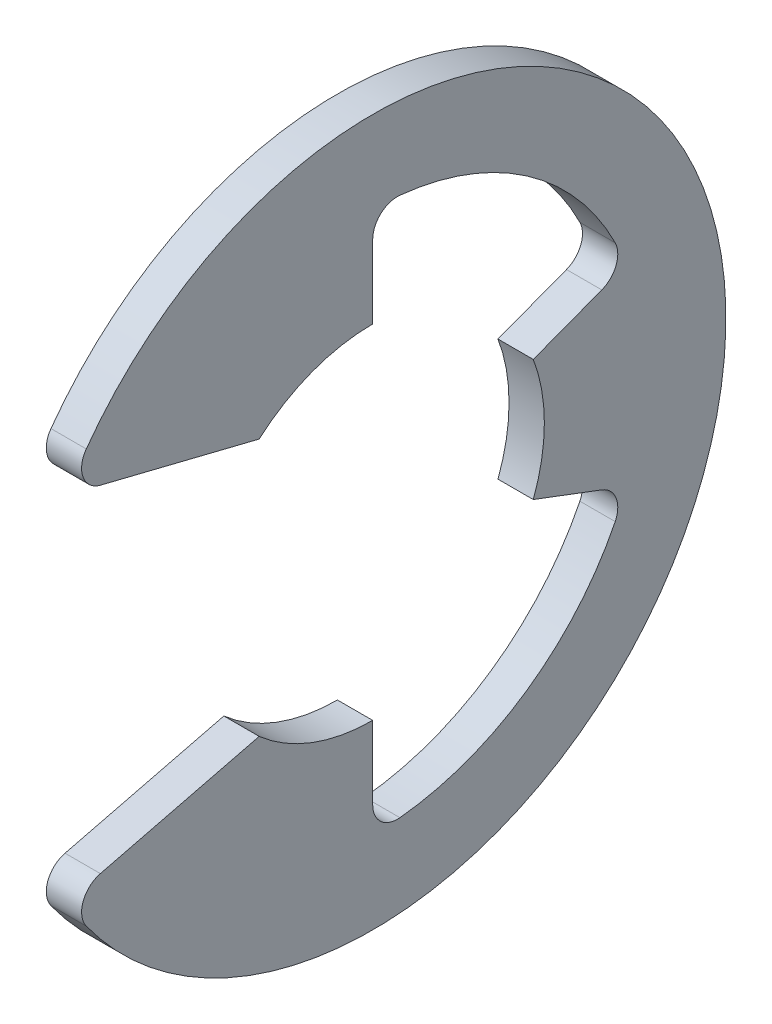
ISO-10303-21;
HEADER;
FILE_DESCRIPTION(('STEP AP214'),'2;1');
FILE_NAME('part.step','',(''),(''),'','','');
FILE_SCHEMA(('AUTOMOTIVE_DESIGN { 1 0 10303 214 1 1 1 1 }'));
ENDSEC;
DATA;
#1=APPLICATION_CONTEXT('core data for automotive mechanical design processes');
#2=APPLICATION_PROTOCOL_DEFINITION('international standard','automotive_design',2000,#1);
#3=PRODUCT_CONTEXT('',#1,'mechanical');
#4=PRODUCT('Part','Part','',(#3));
#5=PRODUCT_RELATED_PRODUCT_CATEGORY('part','',(#4));
#6=PRODUCT_DEFINITION_FORMATION('','',#4);
#7=PRODUCT_DEFINITION_CONTEXT('part definition',#1,'design');
#8=PRODUCT_DEFINITION('design','',#6,#7);
#9=PRODUCT_DEFINITION_SHAPE('','',#8);
#10=(LENGTH_UNIT() NAMED_UNIT(*) SI_UNIT(.MILLI.,.METRE.));
#11=(NAMED_UNIT(*) PLANE_ANGLE_UNIT() SI_UNIT($,.RADIAN.));
#12=(NAMED_UNIT(*) SI_UNIT($,.STERADIAN.) SOLID_ANGLE_UNIT());
#13=UNCERTAINTY_MEASURE_WITH_UNIT(LENGTH_MEASURE(1.E-05),#10,'distance_accuracy_value','');
#14=(GEOMETRIC_REPRESENTATION_CONTEXT(3) GLOBAL_UNCERTAINTY_ASSIGNED_CONTEXT((#13)) GLOBAL_UNIT_ASSIGNED_CONTEXT((#10,
#11,#12)) REPRESENTATION_CONTEXT('',''));
#15=CARTESIAN_POINT('',(0.,0.,0.));
#16=DIRECTION('',(0.,0.,1.));
#17=DIRECTION('',(1.,0.,0.));
#18=AXIS2_PLACEMENT_3D('',#15,#16,#17);
#19=CARTESIAN_POINT('',(0.3175,0.,0.));
#20=DIRECTION('',(-1.,0.,0.));
#21=DIRECTION('',(0.,0.,1.));
#22=AXIS2_PLACEMENT_3D('',#19,#20,#21);
#23=CYLINDRICAL_SURFACE('',#22,6.35);
#24=CARTESIAN_POINT('',(0.3175,0.,0.));
#25=DIRECTION('',(1.,0.,0.));
#26=DIRECTION('',(0.,0.,-1.));
#27=AXIS2_PLACEMENT_3D('',#24,#25,#26);
#28=CIRCLE('',#27,6.35);
#29=CARTESIAN_POINT('',(0.3175,-3.7148992719595,5.14995372786929));
#30=VERTEX_POINT('',#29);
#31=CARTESIAN_POINT('',(0.3175,3.7148992719595,5.14995372786929));
#32=VERTEX_POINT('',#31);
#33=EDGE_CURVE('E172',#30,#32,#28,.T.);
#34=ORIENTED_EDGE('',*,*,#33,.F.);
#35=DIRECTION('',(-1.,0.,0.));
#36=VECTOR('',#35,1.);
#37=CARTESIAN_POINT('',(0.3175,-3.7148992719595,5.14995372786929));
#38=LINE('',#37,#36);
#39=CARTESIAN_POINT('',(-0.3175,-3.7148992719595,5.14995372786929));
#40=VERTEX_POINT('',#39);
#41=EDGE_CURVE('E266',#30,#40,#38,.T.);
#42=ORIENTED_EDGE('',*,*,#41,.T.);
#43=CARTESIAN_POINT('',(-0.3175,0.,0.));
#44=DIRECTION('',(1.,0.,0.));
#45=DIRECTION('',(0.,0.,-1.));
#46=AXIS2_PLACEMENT_3D('',#43,#44,#45);
#47=CIRCLE('',#46,6.35);
#48=CARTESIAN_POINT('',(-0.3175,3.7148992719595,5.14995372786929));
#49=VERTEX_POINT('',#48);
#50=EDGE_CURVE('E210',#40,#49,#47,.T.);
#51=ORIENTED_EDGE('',*,*,#50,.T.);
#52=DIRECTION('',(-1.,0.,0.));
#53=VECTOR('',#52,1.);
#54=CARTESIAN_POINT('',(0.3175,3.7148992719595,5.14995372786929));
#55=LINE('',#54,#53);
#56=EDGE_CURVE('E264',#49,#32,#55,.F.);
#57=ORIENTED_EDGE('',*,*,#56,.T.);
#58=EDGE_LOOP('',(#34,#42,#51,#57));
#59=FACE_BOUND('',#58,.T.);
#60=ADVANCED_FACE('F34',(#59),#23,.T.);
#61=CARTESIAN_POINT('',(0.3175,3.17332392884382,5.5002286536677));
#62=DIRECTION('',(0.,0.970536829925373,-0.240952820606873));
#63=DIRECTION('',(0.,0.240952820606873,0.970536829925373));
#64=AXIS2_PLACEMENT_3D('',#61,#62,#63);
#65=PLANE('',#64);
#66=DIRECTION('',(0.,-0.240952820606873,-0.970536829925373));
#67=VECTOR('',#66,1.);
#68=CARTESIAN_POINT('',(0.3175,3.17332392884382,5.5002286536677));
#69=LINE('',#68,#67);
#70=CARTESIAN_POINT('',(0.3175,3.02345270202051,4.89656049567819));
#71=VERTEX_POINT('',#70);
#72=CARTESIAN_POINT('',(0.3175,2.314575,2.04126328026911));
#73=VERTEX_POINT('',#72);
#74=EDGE_CURVE('E158',#71,#73,#69,.T.);
#75=ORIENTED_EDGE('',*,*,#74,.F.);
#76=DIRECTION('',(-1.,0.,0.));
#77=VECTOR('',#76,1.);
#78=CARTESIAN_POINT('',(0.3175,3.02345270202051,4.89656049567819));
#79=LINE('',#78,#77);
#80=CARTESIAN_POINT('',(-0.3175,3.02345270202051,4.89656049567819));
#81=VERTEX_POINT('',#80);
#82=EDGE_CURVE('E278',#71,#81,#79,.T.);
#83=ORIENTED_EDGE('',*,*,#82,.T.);
#84=DIRECTION('',(0.,-0.240952820606873,-0.970536829925373));
#85=VECTOR('',#84,1.);
#86=CARTESIAN_POINT('',(-0.3175,3.17332392884382,5.5002286536677));
#87=LINE('',#86,#85);
#88=CARTESIAN_POINT('',(-0.3175,2.314575,2.04126328026911));
#89=VERTEX_POINT('',#88);
#90=EDGE_CURVE('E178',#81,#89,#87,.T.);
#91=ORIENTED_EDGE('',*,*,#90,.T.);
#92=DIRECTION('',(-1.,0.,0.));
#93=VECTOR('',#92,1.);
#94=CARTESIAN_POINT('',(0.3175,2.314575,2.04126328026911));
#95=LINE('',#94,#93);
#96=EDGE_CURVE('E175',#73,#89,#95,.T.);
#97=ORIENTED_EDGE('',*,*,#96,.F.);
#98=EDGE_LOOP('',(#75,#83,#91,#97));
#99=FACE_BOUND('',#98,.T.);
#100=ADVANCED_FACE('F176',(#99),#65,.F.);
#101=CARTESIAN_POINT('',(0.3175,0.,0.));
#102=DIRECTION('',(-1.,0.,0.));
#103=DIRECTION('',(0.,0.,1.));
#104=AXIS2_PLACEMENT_3D('',#101,#102,#103);
#105=CYLINDRICAL_SURFACE('',#104,3.0861);
#106=CARTESIAN_POINT('',(-0.3175,0.,0.));
#107=DIRECTION('',(-1.,0.,0.));
#108=DIRECTION('',(0.,0.,1.));
#109=AXIS2_PLACEMENT_3D('',#106,#107,#108);
#110=CIRCLE('',#109,3.0861);
#111=CARTESIAN_POINT('',(-0.3175,3.0861,0.));
#112=VERTEX_POINT('',#111);
#113=EDGE_CURVE('E214',#89,#112,#110,.T.);
#114=ORIENTED_EDGE('',*,*,#113,.T.);
#115=DIRECTION('',(-1.,0.,0.));
#116=VECTOR('',#115,1.);
#117=CARTESIAN_POINT('',(0.3175,3.0861,0.));
#118=LINE('',#117,#116);
#119=CARTESIAN_POINT('',(0.3175,3.0861,0.));
#120=VERTEX_POINT('',#119);
#121=EDGE_CURVE('E182',#120,#112,#118,.T.);
#122=ORIENTED_EDGE('',*,*,#121,.F.);
#123=CARTESIAN_POINT('',(0.3175,0.,0.));
#124=DIRECTION('',(-1.,0.,0.));
#125=DIRECTION('',(0.,0.,1.));
#126=AXIS2_PLACEMENT_3D('',#123,#124,#125);
#127=CIRCLE('',#126,3.0861);
#128=EDGE_CURVE('E164',#73,#120,#127,.T.);
#129=ORIENTED_EDGE('',*,*,#128,.F.);
#130=ORIENTED_EDGE('',*,*,#96,.T.);
#131=EDGE_LOOP('',(#114,#122,#129,#130));
#132=FACE_BOUND('',#131,.T.);
#133=ADVANCED_FACE('F184',(#132),#105,.F.);
#134=CARTESIAN_POINT('',(0.3175,3.0861,0.));
#135=DIRECTION('',(0.,0.,1.));
#136=DIRECTION('',(0.,-1.,0.));
#137=AXIS2_PLACEMENT_3D('',#134,#135,#136);
#138=PLANE('',#137);
#139=DIRECTION('',(0.,1.,0.));
#140=VECTOR('',#139,1.);
#141=CARTESIAN_POINT('',(-0.3175,3.0861,0.));
#142=LINE('',#141,#140);
#143=CARTESIAN_POINT('',(-0.3175,4.40336689167331,0.));
#144=VERTEX_POINT('',#143);
#145=EDGE_CURVE('E216',#112,#144,#142,.T.);
#146=ORIENTED_EDGE('',*,*,#145,.T.);
#147=DIRECTION('',(1.,0.,0.));
#148=VECTOR('',#147,1.);
#149=CARTESIAN_POINT('',(0.3175,4.40336689167331,0.));
#150=LINE('',#149,#148);
#151=CARTESIAN_POINT('',(0.3175,4.40336689167331,0.));
#152=VERTEX_POINT('',#151);
#153=EDGE_CURVE('E262',#144,#152,#150,.T.);
#154=ORIENTED_EDGE('',*,*,#153,.T.);
#155=DIRECTION('',(0.,1.,0.));
#156=VECTOR('',#155,1.);
#157=CARTESIAN_POINT('',(0.3175,3.0861,0.));
#158=LINE('',#157,#156);
#159=EDGE_CURVE('E187',#120,#152,#158,.T.);
#160=ORIENTED_EDGE('',*,*,#159,.F.);
#161=ORIENTED_EDGE('',*,*,#121,.T.);
#162=EDGE_LOOP('',(#146,#154,#160,#161));
#163=FACE_BOUND('',#162,.T.);
#164=ADVANCED_FACE('F384',(#163),#138,.F.);
#165=CARTESIAN_POINT('',(0.3175,0.,0.));
#166=DIRECTION('',(-1.,0.,0.));
#167=DIRECTION('',(0.,0.,1.));
#168=AXIS2_PLACEMENT_3D('',#165,#166,#167);
#169=CYLINDRICAL_SURFACE('',#168,4.87024516129032);
#170=CARTESIAN_POINT('',(0.3175,0.,0.));
#171=DIRECTION('',(-1.,0.,0.));
#172=DIRECTION('',(0.,0.,-1.));
#173=AXIS2_PLACEMENT_3D('',#170,#171,#172);
#174=CIRCLE('',#173,4.87024516129032);
#175=CARTESIAN_POINT('',(0.3175,4.84561932872465,-0.489143386096454));
#176=VERTEX_POINT('',#175);
#177=CARTESIAN_POINT('',(0.3175,2.17073688413976,-4.35972353606361));
#178=VERTEX_POINT('',#177);
#179=EDGE_CURVE('E189',#176,#178,#174,.T.);
#180=ORIENTED_EDGE('',*,*,#179,.F.);
#181=DIRECTION('',(-1.,0.,0.));
#182=VECTOR('',#181,1.);
#183=CARTESIAN_POINT('',(0.3175,4.84561932872465,-0.489143386096454));
#184=LINE('',#183,#182);
#185=CARTESIAN_POINT('',(-0.3175,4.84561932872465,-0.489143386096454));
#186=VERTEX_POINT('',#185);
#187=EDGE_CURVE('E259',#176,#186,#184,.T.);
#188=ORIENTED_EDGE('',*,*,#187,.T.);
#189=CARTESIAN_POINT('',(-0.3175,0.,0.));
#190=DIRECTION('',(-1.,0.,0.));
#191=DIRECTION('',(0.,0.,-1.));
#192=AXIS2_PLACEMENT_3D('',#189,#190,#191);
#193=CIRCLE('',#192,4.87024516129032);
#194=CARTESIAN_POINT('',(-0.3175,2.17073688413976,-4.35972353606361));
#195=VERTEX_POINT('',#194);
#196=EDGE_CURVE('E219',#186,#195,#193,.T.);
#197=ORIENTED_EDGE('',*,*,#196,.T.);
#198=DIRECTION('',(-1.,0.,0.));
#199=VECTOR('',#198,1.);
#200=CARTESIAN_POINT('',(0.3175,2.17073688413976,-4.35972353606361));
#201=LINE('',#200,#199);
#202=EDGE_CURVE('E257',#195,#178,#201,.F.);
#203=ORIENTED_EDGE('',*,*,#202,.T.);
#204=EDGE_LOOP('',(#180,#188,#197,#203));
#205=FACE_BOUND('',#204,.T.);
#206=ADVANCED_FACE('F306',(#205),#169,.F.);
#207=CARTESIAN_POINT('',(0.3175,1.0911011187099,-2.88678221533076));
#208=DIRECTION('',(0.,-0.935414346693485,-0.353553390593274));
#209=DIRECTION('',(0.,0.353553390593274,-0.935414346693485));
#210=AXIS2_PLACEMENT_3D('',#207,#208,#209);
#211=PLANE('',#210);
#212=DIRECTION('',(0.,-0.353553390593274,0.935414346693485));
#213=VECTOR('',#212,1.);
#214=CARTESIAN_POINT('',(0.3175,1.0911011187099,-2.88678221533076));
#215=LINE('',#214,#213);
#216=CARTESIAN_POINT('',(0.3175,1.55682529457727,-4.11897256422632));
#217=VERTEX_POINT('',#216);
#218=CARTESIAN_POINT('',(0.3175,1.0911011187099,-2.88678221533077));
#219=VERTEX_POINT('',#218);
#220=EDGE_CURVE('E194',#217,#219,#215,.T.);
#221=ORIENTED_EDGE('',*,*,#220,.F.);
#222=DIRECTION('',(1.,0.,0.));
#223=VECTOR('',#222,1.);
#224=CARTESIAN_POINT('',(-0.3175,1.55682529457727,-4.11897256422632));
#225=LINE('',#224,#223);
#226=CARTESIAN_POINT('',(-0.3175,1.55682529457727,-4.11897256422632));
#227=VERTEX_POINT('',#226);
#228=EDGE_CURVE('E281',#217,#227,#225,.F.);
#229=ORIENTED_EDGE('',*,*,#228,.T.);
#230=DIRECTION('',(0.,-0.353553390593274,0.935414346693485));
#231=VECTOR('',#230,1.);
#232=CARTESIAN_POINT('',(-0.3175,1.0911011187099,-2.88678221533076));
#233=LINE('',#232,#231);
#234=CARTESIAN_POINT('',(-0.3175,1.0911011187099,-2.88678221533077));
#235=VERTEX_POINT('',#234);
#236=EDGE_CURVE('E222',#227,#235,#233,.T.);
#237=ORIENTED_EDGE('',*,*,#236,.T.);
#238=DIRECTION('',(-1.,0.,0.));
#239=VECTOR('',#238,1.);
#240=CARTESIAN_POINT('',(0.3175,1.0911011187099,-2.88678221533077));
#241=LINE('',#240,#239);
#242=EDGE_CURVE('E246',#219,#235,#241,.T.);
#243=ORIENTED_EDGE('',*,*,#242,.F.);
#244=EDGE_LOOP('',(#221,#229,#237,#243));
#245=FACE_BOUND('',#244,.T.);
#246=ADVANCED_FACE('F309',(#245),#211,.F.);
#247=CARTESIAN_POINT('',(0.3175,0.,0.));
#248=DIRECTION('',(-1.,0.,0.));
#249=DIRECTION('',(0.,0.,1.));
#250=AXIS2_PLACEMENT_3D('',#247,#248,#249);
#251=CYLINDRICAL_SURFACE('',#250,3.0861);
#252=CARTESIAN_POINT('',(-0.3175,0.,0.));
#253=DIRECTION('',(-1.,0.,0.));
#254=DIRECTION('',(0.,0.,1.));
#255=AXIS2_PLACEMENT_3D('',#252,#253,#254);
#256=CIRCLE('',#255,3.0861);
#257=CARTESIAN_POINT('',(-0.3175,-1.0911011187099,-2.88678221533077));
#258=VERTEX_POINT('',#257);
#259=EDGE_CURVE('E224',#235,#258,#256,.T.);
#260=ORIENTED_EDGE('',*,*,#259,.T.);
#261=DIRECTION('',(-1.,0.,0.));
#262=VECTOR('',#261,1.);
#263=CARTESIAN_POINT('',(0.3175,-1.0911011187099,-2.88678221533077));
#264=LINE('',#263,#262);
#265=CARTESIAN_POINT('',(0.3175,-1.0911011187099,-2.88678221533077));
#266=VERTEX_POINT('',#265);
#267=EDGE_CURVE('E243',#266,#258,#264,.T.);
#268=ORIENTED_EDGE('',*,*,#267,.F.);
#269=CARTESIAN_POINT('',(0.3175,0.,0.));
#270=DIRECTION('',(-1.,0.,0.));
#271=DIRECTION('',(0.,0.,1.));
#272=AXIS2_PLACEMENT_3D('',#269,#270,#271);
#273=CIRCLE('',#272,3.0861);
#274=EDGE_CURVE('E196',#219,#266,#273,.T.);
#275=ORIENTED_EDGE('',*,*,#274,.F.);
#276=ORIENTED_EDGE('',*,*,#242,.T.);
#277=EDGE_LOOP('',(#260,#268,#275,#276));
#278=FACE_BOUND('',#277,.T.);
#279=ADVANCED_FACE('F315',(#278),#251,.F.);
#280=CARTESIAN_POINT('',(0.3175,-1.0911011187099,-2.88678221533077));
#281=DIRECTION('',(0.,0.935414346693485,-0.353553390593274));
#282=DIRECTION('',(0.,0.353553390593274,0.935414346693485));
#283=AXIS2_PLACEMENT_3D('',#280,#281,#282);
#284=PLANE('',#283);
#285=DIRECTION('',(0.,-0.353553390593274,-0.935414346693485));
#286=VECTOR('',#285,1.);
#287=CARTESIAN_POINT('',(-0.3175,-1.0911011187099,-2.88678221533077));
#288=LINE('',#287,#286);
#289=CARTESIAN_POINT('',(-0.3175,-1.55682529457726,-4.11897256422632));
#290=VERTEX_POINT('',#289);
#291=EDGE_CURVE('E226',#258,#290,#288,.T.);
#292=ORIENTED_EDGE('',*,*,#291,.T.);
#293=DIRECTION('',(1.,0.,0.));
#294=VECTOR('',#293,1.);
#295=CARTESIAN_POINT('',(0.3175,-1.55682529457726,-4.11897256422632));
#296=LINE('',#295,#294);
#297=CARTESIAN_POINT('',(0.3175,-1.55682529457726,-4.11897256422632));
#298=VERTEX_POINT('',#297);
#299=EDGE_CURVE('E49',#290,#298,#296,.T.);
#300=ORIENTED_EDGE('',*,*,#299,.T.);
#301=DIRECTION('',(0.,-0.353553390593274,-0.935414346693485));
#302=VECTOR('',#301,1.);
#303=CARTESIAN_POINT('',(0.3175,-1.0911011187099,-2.88678221533077));
#304=LINE('',#303,#302);
#305=EDGE_CURVE('E198',#266,#298,#304,.T.);
#306=ORIENTED_EDGE('',*,*,#305,.F.);
#307=ORIENTED_EDGE('',*,*,#267,.T.);
#308=EDGE_LOOP('',(#292,#300,#306,#307));
#309=FACE_BOUND('',#308,.T.);
#310=ADVANCED_FACE('F317',(#309),#284,.F.);
#311=CARTESIAN_POINT('',(0.3175,0.,0.));
#312=DIRECTION('',(-1.,0.,0.));
#313=DIRECTION('',(0.,0.,1.));
#314=AXIS2_PLACEMENT_3D('',#311,#312,#313);
#315=CYLINDRICAL_SURFACE('',#314,4.87024516129032);
#316=CARTESIAN_POINT('',(-0.3175,0.,0.));
#317=DIRECTION('',(-1.,0.,0.));
#318=DIRECTION('',(0.,0.,-1.));
#319=AXIS2_PLACEMENT_3D('',#316,#317,#318);
#320=CIRCLE('',#319,4.87024516129032);
#321=CARTESIAN_POINT('',(-0.3175,-2.17073688413975,-4.35972353606361));
#322=VERTEX_POINT('',#321);
#323=CARTESIAN_POINT('',(-0.3175,-4.84561932872465,-0.489143386096455));
#324=VERTEX_POINT('',#323);
#325=EDGE_CURVE('E228',#322,#324,#320,.T.);
#326=ORIENTED_EDGE('',*,*,#325,.T.);
#327=DIRECTION('',(-1.,0.,0.));
#328=VECTOR('',#327,1.);
#329=CARTESIAN_POINT('',(0.3175,-4.84561932872465,-0.489143386096455));
#330=LINE('',#329,#328);
#331=CARTESIAN_POINT('',(0.3175,-4.84561932872465,-0.489143386096455));
#332=VERTEX_POINT('',#331);
#333=EDGE_CURVE('E255',#324,#332,#330,.F.);
#334=ORIENTED_EDGE('',*,*,#333,.T.);
#335=CARTESIAN_POINT('',(0.3175,0.,0.));
#336=DIRECTION('',(-1.,0.,0.));
#337=DIRECTION('',(0.,0.,-1.));
#338=AXIS2_PLACEMENT_3D('',#335,#336,#337);
#339=CIRCLE('',#338,4.87024516129032);
#340=CARTESIAN_POINT('',(0.3175,-2.17073688413975,-4.35972353606361));
#341=VERTEX_POINT('',#340);
#342=EDGE_CURVE('E200',#341,#332,#339,.T.);
#343=ORIENTED_EDGE('',*,*,#342,.F.);
#344=DIRECTION('',(-1.,0.,0.));
#345=VECTOR('',#344,1.);
#346=CARTESIAN_POINT('',(0.3175,-2.17073688413975,-4.35972353606361));
#347=LINE('',#346,#345);
#348=EDGE_CURVE('E252',#341,#322,#347,.T.);
#349=ORIENTED_EDGE('',*,*,#348,.T.);
#350=EDGE_LOOP('',(#326,#334,#343,#349));
#351=FACE_BOUND('',#350,.T.);
#352=ADVANCED_FACE('F319',(#351),#315,.F.);
#353=CARTESIAN_POINT('',(0.3175,-3.0861,0.));
#354=DIRECTION('',(0.,0.,1.));
#355=DIRECTION('',(0.,-1.,0.));
#356=AXIS2_PLACEMENT_3D('',#353,#354,#355);
#357=PLANE('',#356);
#358=DIRECTION('',(0.,1.,0.));
#359=VECTOR('',#358,1.);
#360=CARTESIAN_POINT('',(0.3175,-3.0861,0.));
#361=LINE('',#360,#359);
#362=CARTESIAN_POINT('',(0.3175,-4.40336689167331,0.));
#363=VERTEX_POINT('',#362);
#364=CARTESIAN_POINT('',(0.3175,-3.0861,0.));
#365=VERTEX_POINT('',#364);
#366=EDGE_CURVE('E203',#363,#365,#361,.T.);
#367=ORIENTED_EDGE('',*,*,#366,.F.);
#368=DIRECTION('',(1.,0.,0.));
#369=VECTOR('',#368,1.);
#370=CARTESIAN_POINT('',(-0.3175,-4.40336689167331,0.));
#371=LINE('',#370,#369);
#372=CARTESIAN_POINT('',(-0.3175,-4.40336689167331,0.));
#373=VERTEX_POINT('',#372);
#374=EDGE_CURVE('E181',#363,#373,#371,.F.);
#375=ORIENTED_EDGE('',*,*,#374,.T.);
#376=DIRECTION('',(0.,1.,0.));
#377=VECTOR('',#376,1.);
#378=CARTESIAN_POINT('',(-0.3175,-3.0861,0.));
#379=LINE('',#378,#377);
#380=CARTESIAN_POINT('',(-0.3175,-3.0861,0.));
#381=VERTEX_POINT('',#380);
#382=EDGE_CURVE('E231',#373,#381,#379,.T.);
#383=ORIENTED_EDGE('',*,*,#382,.T.);
#384=DIRECTION('',(-1.,0.,0.));
#385=VECTOR('',#384,1.);
#386=CARTESIAN_POINT('',(0.3175,-3.0861,0.));
#387=LINE('',#386,#385);
#388=EDGE_CURVE('E240',#365,#381,#387,.T.);
#389=ORIENTED_EDGE('',*,*,#388,.F.);
#390=EDGE_LOOP('',(#367,#375,#383,#389));
#391=FACE_BOUND('',#390,.T.);
#392=ADVANCED_FACE('F325',(#391),#357,.F.);
#393=CARTESIAN_POINT('',(0.3175,0.,0.));
#394=DIRECTION('',(-1.,0.,0.));
#395=DIRECTION('',(0.,0.,1.));
#396=AXIS2_PLACEMENT_3D('',#393,#394,#395);
#397=CYLINDRICAL_SURFACE('',#396,3.0861);
#398=CARTESIAN_POINT('',(-0.3175,0.,0.));
#399=DIRECTION('',(-1.,0.,0.));
#400=DIRECTION('',(0.,0.,-1.));
#401=AXIS2_PLACEMENT_3D('',#398,#399,#400);
#402=CIRCLE('',#401,3.0861);
#403=CARTESIAN_POINT('',(-0.3175,-2.314575,2.04126328026911));
#404=VERTEX_POINT('',#403);
#405=EDGE_CURVE('E233',#381,#404,#402,.T.);
#406=ORIENTED_EDGE('',*,*,#405,.T.);
#407=DIRECTION('',(-1.,0.,0.));
#408=VECTOR('',#407,1.);
#409=CARTESIAN_POINT('',(0.3175,-2.314575,2.04126328026911));
#410=LINE('',#409,#408);
#411=CARTESIAN_POINT('',(0.3175,-2.314575,2.04126328026911));
#412=VERTEX_POINT('',#411);
#413=EDGE_CURVE('E209',#412,#404,#410,.T.);
#414=ORIENTED_EDGE('',*,*,#413,.F.);
#415=CARTESIAN_POINT('',(0.3175,0.,0.));
#416=DIRECTION('',(-1.,0.,0.));
#417=DIRECTION('',(0.,0.,-1.));
#418=AXIS2_PLACEMENT_3D('',#415,#416,#417);
#419=CIRCLE('',#418,3.0861);
#420=EDGE_CURVE('E205',#365,#412,#419,.T.);
#421=ORIENTED_EDGE('',*,*,#420,.F.);
#422=ORIENTED_EDGE('',*,*,#388,.T.);
#423=EDGE_LOOP('',(#406,#414,#421,#422));
#424=FACE_BOUND('',#423,.T.);
#425=ADVANCED_FACE('F374',(#424),#397,.F.);
#426=CARTESIAN_POINT('',(0.3175,-3.17332392884383,5.5002286536677));
#427=DIRECTION('',(0.,-0.970536829925373,-0.240952820606873));
#428=DIRECTION('',(0.,0.240952820606873,-0.970536829925373));
#429=AXIS2_PLACEMENT_3D('',#426,#427,#428);
#430=PLANE('',#429);
#431=DIRECTION('',(0.,-0.240952820606873,0.970536829925373));
#432=VECTOR('',#431,1.);
#433=CARTESIAN_POINT('',(-0.3175,-3.17332392884383,5.5002286536677));
#434=LINE('',#433,#432);
#435=CARTESIAN_POINT('',(-0.3175,-3.02345270202051,4.89656049567819));
#436=VERTEX_POINT('',#435);
#437=EDGE_CURVE('E235',#404,#436,#434,.T.);
#438=ORIENTED_EDGE('',*,*,#437,.T.);
#439=DIRECTION('',(-1.,0.,0.));
#440=VECTOR('',#439,1.);
#441=CARTESIAN_POINT('',(0.3175,-3.02345270202051,4.89656049567819));
#442=LINE('',#441,#440);
#443=CARTESIAN_POINT('',(0.3175,-3.02345270202051,4.89656049567819));
#444=VERTEX_POINT('',#443);
#445=EDGE_CURVE('E273',#436,#444,#442,.F.);
#446=ORIENTED_EDGE('',*,*,#445,.T.);
#447=DIRECTION('',(0.,-0.240952820606873,0.970536829925373));
#448=VECTOR('',#447,1.);
#449=CARTESIAN_POINT('',(0.3175,-3.17332392884383,5.5002286536677));
#450=LINE('',#449,#448);
#451=EDGE_CURVE('E207',#412,#444,#450,.T.);
#452=ORIENTED_EDGE('',*,*,#451,.F.);
#453=ORIENTED_EDGE('',*,*,#413,.T.);
#454=EDGE_LOOP('',(#438,#446,#452,#453));
#455=FACE_BOUND('',#454,.T.);
#456=ADVANCED_FACE('F416',(#455),#430,.F.);
#457=CARTESIAN_POINT('',(0.3175,0.,0.));
#458=DIRECTION('',(1.,0.,0.));
#459=DIRECTION('',(0.,0.,-1.));
#460=AXIS2_PLACEMENT_3D('',#457,#458,#459);
#461=PLANE('',#460);
#462=ORIENTED_EDGE('',*,*,#451,.T.);
#463=CARTESIAN_POINT('',(0.3175,-3.45485632292234,4.78945696691844));
#464=DIRECTION('',(1.,0.,0.));
#465=DIRECTION('',(0.,0.,-1.));
#466=AXIS2_PLACEMENT_3D('',#463,#464,#465);
#467=CIRCLE('',#466,0.4445);
#468=EDGE_CURVE('E276',#444,#30,#467,.T.);
#469=ORIENTED_EDGE('',*,*,#468,.T.);
#470=ORIENTED_EDGE('',*,*,#33,.T.);
#471=CARTESIAN_POINT('',(0.3175,3.45485632292234,4.78945696691844));
#472=DIRECTION('',(1.,0.,0.));
#473=DIRECTION('',(0.,0.,-1.));
#474=AXIS2_PLACEMENT_3D('',#471,#472,#473);
#475=CIRCLE('',#474,0.4445);
#476=EDGE_CURVE('E168',#32,#71,#475,.T.);
#477=ORIENTED_EDGE('',*,*,#476,.T.);
#478=ORIENTED_EDGE('',*,*,#74,.T.);
#479=ORIENTED_EDGE('',*,*,#128,.T.);
#480=ORIENTED_EDGE('',*,*,#159,.T.);
#481=CARTESIAN_POINT('',(0.3175,4.40336689167331,-0.444499999999999));
#482=DIRECTION('',(1.,0.,0.));
#483=DIRECTION('',(0.,0.,-1.));
#484=AXIS2_PLACEMENT_3D('',#481,#482,#483);
#485=CIRCLE('',#484,0.4445);
#486=EDGE_CURVE('E290',#152,#176,#485,.F.);
#487=ORIENTED_EDGE('',*,*,#486,.T.);
#488=ORIENTED_EDGE('',*,*,#179,.T.);
#489=CARTESIAN_POINT('',(0.3175,1.97261697168252,-3.96181808210761));
#490=DIRECTION('',(1.,0.,0.));
#491=DIRECTION('',(0.,0.,-1.));
#492=AXIS2_PLACEMENT_3D('',#489,#490,#491);
#493=CIRCLE('',#492,0.4445);
#494=EDGE_CURVE('E11',#178,#217,#493,.F.);
#495=ORIENTED_EDGE('',*,*,#494,.T.);
#496=ORIENTED_EDGE('',*,*,#220,.T.);
#497=ORIENTED_EDGE('',*,*,#274,.T.);
#498=ORIENTED_EDGE('',*,*,#305,.T.);
#499=CARTESIAN_POINT('',(0.3175,-1.97261697168252,-3.96181808210761));
#500=DIRECTION('',(1.,0.,0.));
#501=DIRECTION('',(0.,0.,-1.));
#502=AXIS2_PLACEMENT_3D('',#499,#500,#501);
#503=CIRCLE('',#502,0.4445);
#504=EDGE_CURVE('E294',#298,#341,#503,.F.);
#505=ORIENTED_EDGE('',*,*,#504,.T.);
#506=ORIENTED_EDGE('',*,*,#342,.T.);
#507=CARTESIAN_POINT('',(0.3175,-4.40336689167331,-0.4445));
#508=DIRECTION('',(1.,0.,0.));
#509=DIRECTION('',(0.,0.,-1.));
#510=AXIS2_PLACEMENT_3D('',#507,#508,#509);
#511=CIRCLE('',#510,0.4445);
#512=EDGE_CURVE('E286',#332,#363,#511,.F.);
#513=ORIENTED_EDGE('',*,*,#512,.T.);
#514=ORIENTED_EDGE('',*,*,#366,.T.);
#515=ORIENTED_EDGE('',*,*,#420,.T.);
#516=EDGE_LOOP('',(#462,#469,#470,#477,#478,#479,#480,#487,#488,#495,#496,#497,#498,#505,#506,
#513,#514,#515));
#517=FACE_BOUND('',#516,.T.);
#518=ADVANCED_FACE('F161',(#517),#461,.T.);
#519=CARTESIAN_POINT('',(-0.3175,0.,0.));
#520=DIRECTION('',(1.,0.,0.));
#521=DIRECTION('',(0.,0.,-1.));
#522=AXIS2_PLACEMENT_3D('',#519,#520,#521);
#523=PLANE('',#522);
#524=ORIENTED_EDGE('',*,*,#50,.F.);
#525=CARTESIAN_POINT('',(-0.3175,-3.45485632292234,4.78945696691844));
#526=DIRECTION('',(1.,0.,0.));
#527=DIRECTION('',(0.,0.,-1.));
#528=AXIS2_PLACEMENT_3D('',#525,#526,#527);
#529=CIRCLE('',#528,0.4445);
#530=EDGE_CURVE('E271',#40,#436,#529,.F.);
#531=ORIENTED_EDGE('',*,*,#530,.T.);
#532=ORIENTED_EDGE('',*,*,#437,.F.);
#533=ORIENTED_EDGE('',*,*,#405,.F.);
#534=ORIENTED_EDGE('',*,*,#382,.F.);
#535=CARTESIAN_POINT('',(-0.3175,-4.40336689167331,-0.4445));
#536=DIRECTION('',(1.,0.,0.));
#537=DIRECTION('',(0.,0.,-1.));
#538=AXIS2_PLACEMENT_3D('',#535,#536,#537);
#539=CIRCLE('',#538,0.4445);
#540=EDGE_CURVE('E284',#373,#324,#539,.T.);
#541=ORIENTED_EDGE('',*,*,#540,.T.);
#542=ORIENTED_EDGE('',*,*,#325,.F.);
#543=CARTESIAN_POINT('',(-0.3175,-1.97261697168252,-3.96181808210761));
#544=DIRECTION('',(1.,0.,0.));
#545=DIRECTION('',(0.,0.,-1.));
#546=AXIS2_PLACEMENT_3D('',#543,#544,#545);
#547=CIRCLE('',#546,0.4445);
#548=EDGE_CURVE('E292',#322,#290,#547,.T.);
#549=ORIENTED_EDGE('',*,*,#548,.T.);
#550=ORIENTED_EDGE('',*,*,#291,.F.);
#551=ORIENTED_EDGE('',*,*,#259,.F.);
#552=ORIENTED_EDGE('',*,*,#236,.F.);
#553=CARTESIAN_POINT('',(-0.3175,1.97261697168252,-3.96181808210761));
#554=DIRECTION('',(1.,0.,0.));
#555=DIRECTION('',(0.,0.,-1.));
#556=AXIS2_PLACEMENT_3D('',#553,#554,#555);
#557=CIRCLE('',#556,0.4445);
#558=EDGE_CURVE('E42',#227,#195,#557,.T.);
#559=ORIENTED_EDGE('',*,*,#558,.T.);
#560=ORIENTED_EDGE('',*,*,#196,.F.);
#561=CARTESIAN_POINT('',(-0.3175,4.40336689167331,-0.444499999999999));
#562=DIRECTION('',(1.,0.,0.));
#563=DIRECTION('',(0.,0.,-1.));
#564=AXIS2_PLACEMENT_3D('',#561,#562,#563);
#565=CIRCLE('',#564,0.4445);
#566=EDGE_CURVE('E288',#186,#144,#565,.T.);
#567=ORIENTED_EDGE('',*,*,#566,.T.);
#568=ORIENTED_EDGE('',*,*,#145,.F.);
#569=ORIENTED_EDGE('',*,*,#113,.F.);
#570=ORIENTED_EDGE('',*,*,#90,.F.);
#571=CARTESIAN_POINT('',(-0.3175,3.45485632292234,4.78945696691844));
#572=DIRECTION('',(1.,0.,0.));
#573=DIRECTION('',(0.,0.,-1.));
#574=AXIS2_PLACEMENT_3D('',#571,#572,#573);
#575=CIRCLE('',#574,0.4445);
#576=EDGE_CURVE('E269',#81,#49,#575,.F.);
#577=ORIENTED_EDGE('',*,*,#576,.T.);
#578=EDGE_LOOP('',(#524,#531,#532,#533,#534,#541,#542,#549,#550,#551,#552,#559,#560,#567,#568,
#569,#570,#577));
#579=FACE_BOUND('',#578,.T.);
#580=ADVANCED_FACE('F299',(#579),#523,.F.);
#581=CARTESIAN_POINT('',(0.3175,-4.40336689167331,-0.4445));
#582=DIRECTION('',(-1.,0.,0.));
#583=DIRECTION('',(0.,0.,1.));
#584=AXIS2_PLACEMENT_3D('',#581,#582,#583);
#585=CYLINDRICAL_SURFACE('',#584,0.4445);
#586=ORIENTED_EDGE('',*,*,#512,.F.);
#587=ORIENTED_EDGE('',*,*,#333,.F.);
#588=ORIENTED_EDGE('',*,*,#540,.F.);
#589=ORIENTED_EDGE('',*,*,#374,.F.);
#590=EDGE_LOOP('',(#586,#587,#588,#589));
#591=FACE_BOUND('',#590,.T.);
#592=ADVANCED_FACE('F339',(#591),#585,.F.);
#593=CARTESIAN_POINT('',(0.3175,4.40336689167331,-0.444499999999999));
#594=DIRECTION('',(-1.,0.,0.));
#595=DIRECTION('',(0.,0.,1.));
#596=AXIS2_PLACEMENT_3D('',#593,#594,#595);
#597=CYLINDRICAL_SURFACE('',#596,0.4445);
#598=ORIENTED_EDGE('',*,*,#486,.F.);
#599=ORIENTED_EDGE('',*,*,#153,.F.);
#600=ORIENTED_EDGE('',*,*,#566,.F.);
#601=ORIENTED_EDGE('',*,*,#187,.F.);
#602=EDGE_LOOP('',(#598,#599,#600,#601));
#603=FACE_BOUND('',#602,.T.);
#604=ADVANCED_FACE('F342',(#603),#597,.F.);
#605=CARTESIAN_POINT('',(0.3175,-3.45485632292234,4.78945696691844));
#606=DIRECTION('',(-1.,0.,0.));
#607=DIRECTION('',(0.,0.,1.));
#608=AXIS2_PLACEMENT_3D('',#605,#606,#607);
#609=CYLINDRICAL_SURFACE('',#608,0.4445);
#610=ORIENTED_EDGE('',*,*,#468,.F.);
#611=ORIENTED_EDGE('',*,*,#445,.F.);
#612=ORIENTED_EDGE('',*,*,#530,.F.);
#613=ORIENTED_EDGE('',*,*,#41,.F.);
#614=EDGE_LOOP('',(#610,#611,#612,#613));
#615=FACE_BOUND('',#614,.T.);
#616=ADVANCED_FACE('F346',(#615),#609,.T.);
#617=CARTESIAN_POINT('',(0.3175,3.45485632292234,4.78945696691844));
#618=DIRECTION('',(-1.,0.,0.));
#619=DIRECTION('',(0.,0.,1.));
#620=AXIS2_PLACEMENT_3D('',#617,#618,#619);
#621=CYLINDRICAL_SURFACE('',#620,0.4445);
#622=ORIENTED_EDGE('',*,*,#476,.F.);
#623=ORIENTED_EDGE('',*,*,#56,.F.);
#624=ORIENTED_EDGE('',*,*,#576,.F.);
#625=ORIENTED_EDGE('',*,*,#82,.F.);
#626=EDGE_LOOP('',(#622,#623,#624,#625));
#627=FACE_BOUND('',#626,.T.);
#628=ADVANCED_FACE('F350',(#627),#621,.T.);
#629=CARTESIAN_POINT('',(0.3175,-1.97261697168252,-3.96181808210761));
#630=DIRECTION('',(-1.,0.,0.));
#631=DIRECTION('',(0.,0.,1.));
#632=AXIS2_PLACEMENT_3D('',#629,#630,#631);
#633=CYLINDRICAL_SURFACE('',#632,0.4445);
#634=ORIENTED_EDGE('',*,*,#504,.F.);
#635=ORIENTED_EDGE('',*,*,#299,.F.);
#636=ORIENTED_EDGE('',*,*,#548,.F.);
#637=ORIENTED_EDGE('',*,*,#348,.F.);
#638=EDGE_LOOP('',(#634,#635,#636,#637));
#639=FACE_BOUND('',#638,.T.);
#640=ADVANCED_FACE('F353',(#639),#633,.F.);
#641=CARTESIAN_POINT('',(0.3175,1.97261697168252,-3.96181808210761));
#642=DIRECTION('',(-1.,0.,0.));
#643=DIRECTION('',(0.,0.,1.));
#644=AXIS2_PLACEMENT_3D('',#641,#642,#643);
#645=CYLINDRICAL_SURFACE('',#644,0.4445);
#646=ORIENTED_EDGE('',*,*,#494,.F.);
#647=ORIENTED_EDGE('',*,*,#202,.F.);
#648=ORIENTED_EDGE('',*,*,#558,.F.);
#649=ORIENTED_EDGE('',*,*,#228,.F.);
#650=EDGE_LOOP('',(#646,#647,#648,#649));
#651=FACE_BOUND('',#650,.T.);
#652=ADVANCED_FACE('F36',(#651),#645,.F.);
#653=CLOSED_SHELL('',(#60,#100,#133,#164,#206,#246,#279,#310,#352,#392,#425,#456,#518,#580,#592,
#604,#616,#628,#640,#652));
#654=MANIFOLD_SOLID_BREP('B2',#653);
#655=ADVANCED_BREP_SHAPE_REPRESENTATION('',(#18,#654),#14);
#656=SHAPE_DEFINITION_REPRESENTATION(#9,#655);
ENDSEC;
END-ISO-10303-21;
